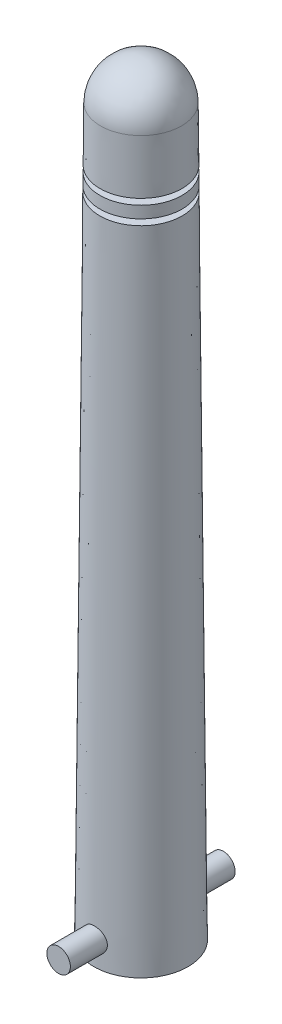
ISO-10303-21;
HEADER;
FILE_DESCRIPTION(('STEP AP214'),'2;1');
FILE_NAME('part.step','',(''),(''),'','','');
FILE_SCHEMA(('AUTOMOTIVE_DESIGN { 1 0 10303 214 1 1 1 1 }'));
ENDSEC;
DATA;
#1=APPLICATION_CONTEXT('core data for automotive mechanical design processes');
#2=APPLICATION_PROTOCOL_DEFINITION('international standard','automotive_design',2000,#1);
#3=PRODUCT_CONTEXT('',#1,'mechanical');
#4=PRODUCT('Part','Part','',(#3));
#5=PRODUCT_RELATED_PRODUCT_CATEGORY('part','',(#4));
#6=PRODUCT_DEFINITION_FORMATION('','',#4);
#7=PRODUCT_DEFINITION_CONTEXT('part definition',#1,'design');
#8=PRODUCT_DEFINITION('design','',#6,#7);
#9=PRODUCT_DEFINITION_SHAPE('','',#8);
#10=(LENGTH_UNIT() NAMED_UNIT(*) SI_UNIT(.MILLI.,.METRE.));
#11=(NAMED_UNIT(*) PLANE_ANGLE_UNIT() SI_UNIT($,.RADIAN.));
#12=(NAMED_UNIT(*) SI_UNIT($,.STERADIAN.) SOLID_ANGLE_UNIT());
#13=UNCERTAINTY_MEASURE_WITH_UNIT(LENGTH_MEASURE(1.E-05),#10,'distance_accuracy_value','');
#14=(GEOMETRIC_REPRESENTATION_CONTEXT(3) GLOBAL_UNCERTAINTY_ASSIGNED_CONTEXT((#13)) GLOBAL_UNIT_ASSIGNED_CONTEXT((#10,
#11,#12)) REPRESENTATION_CONTEXT('',''));
#15=CARTESIAN_POINT('',(0.,0.,0.));
#16=DIRECTION('',(0.,0.,1.));
#17=DIRECTION('',(1.,0.,0.));
#18=AXIS2_PLACEMENT_3D('',#15,#16,#17);
#19=CARTESIAN_POINT('',(0.,0.,0.));
#20=DIRECTION('',(0.,-1.,0.));
#21=DIRECTION('',(0.,0.,-1.));
#22=AXIS2_PLACEMENT_3D('',#19,#20,#21);
#23=CONICAL_SURFACE('',#22,4.,0.00909065866505982);
#24=CARTESIAN_POINT('',(-0.73660515930583,1.32367697120054,3.91934818899298));
#25=CARTESIAN_POINT('',(-0.774372860458464,1.36481272269918,3.91186977942301));
#26=CARTESIAN_POINT('',(-0.808705328189972,1.40913458850612,3.90443939854325));
#27=CARTESIAN_POINT('',(-0.869555005207858,1.5030040900126,3.89046658717942));
#28=CARTESIAN_POINT('',(-0.896068718564904,1.55255404989926,3.88392455459773));
#29=CARTESIAN_POINT('',(-0.940503655070228,1.65561142392132,3.87244123599407));
#30=CARTESIAN_POINT('',(-0.958416282150478,1.70912273572466,3.86750155297934));
#31=CARTESIAN_POINT('',(-0.985006773466895,1.81853540957873,3.85978913531582));
#32=CARTESIAN_POINT('',(-0.993687289706929,1.87443608046321,3.85701577843188));
#33=CARTESIAN_POINT('',(-1.00141962204964,1.98574295953534,3.85396984714066));
#34=CARTESIAN_POINT('',(-1.00067664784285,2.04113350040646,3.85364422050068));
#35=CARTESIAN_POINT('',(-0.990073564216221,2.15099560513558,3.85535064048157));
#36=CARTESIAN_POINT('',(-0.98021368979984,2.20546719264429,3.85738262633136));
#37=CARTESIAN_POINT('',(-0.951871573275743,2.31129864991127,3.86348186915391));
#38=CARTESIAN_POINT('',(-0.933492400891051,2.3626876435991,3.86752483807547));
#39=CARTESIAN_POINT('',(-0.888706923193569,2.46168461670981,3.8771369537));
#40=CARTESIAN_POINT('',(-0.862299556027067,2.50929209491718,3.88270630228082));
#41=CARTESIAN_POINT('',(-0.801497334821846,2.60056440839788,3.89486956118044));
#42=CARTESIAN_POINT('',(-0.766932818245192,2.64411345110363,3.90148408113893));
#43=CARTESIAN_POINT('',(-0.69109207671176,2.72488742760387,3.91488337128324));
#44=CARTESIAN_POINT('',(-0.649814897373874,2.76211146059119,3.92166816556184));
#45=CARTESIAN_POINT('',(-0.560670849799598,2.8299706979853,3.93478877360934));
#46=CARTESIAN_POINT('',(-0.512682857562927,2.8604495327747,3.9411120235586));
#47=CARTESIAN_POINT('',(-0.412114007349366,2.91289497938676,3.95241356570104));
#48=CARTESIAN_POINT('',(-0.359533571868839,2.93486237323773,3.95739198144438));
#49=CARTESIAN_POINT('',(-0.251930893523478,2.96937282721946,3.96537236189164));
#50=CARTESIAN_POINT('',(-0.196946316119994,2.98202771230592,3.96839772287688));
#51=CARTESIAN_POINT('',(-0.0855598352786088,2.9979193260804,3.97221529815477));
#52=CARTESIAN_POINT('',(-0.0291581736937885,3.00115765102228,3.97300789093574));
#53=CARTESIAN_POINT('',(0.0819872861843836,2.99814496307054,3.97227747631158));
#54=CARTESIAN_POINT('',(0.136737867375657,2.99212432332303,3.97081068343005));
#55=CARTESIAN_POINT('',(0.244420206742673,2.9712193864096,3.96582979213715));
#56=CARTESIAN_POINT('',(0.297351943933323,2.95633498701348,3.96231567011291));
#57=CARTESIAN_POINT('',(0.40001483050218,2.9181461649952,3.95362152238037));
#58=CARTESIAN_POINT('',(0.449741510251333,2.89483027125603,3.94843922817037));
#59=CARTESIAN_POINT('',(0.54462790424883,2.84045917659999,3.93697287419231));
#60=CARTESIAN_POINT('',(0.589786903278025,2.80940276628242,3.93068864229985));
#61=CARTESIAN_POINT('',(0.675466054546069,2.73951195541144,3.91753192199128));
#62=CARTESIAN_POINT('',(0.715841394235425,2.70050195901287,3.91064863035481));
#63=CARTESIAN_POINT('',(0.78953730230251,2.61624971843899,3.89722082735216));
#64=CARTESIAN_POINT('',(0.822857226768731,2.57100690604801,3.89067634694868));
#65=CARTESIAN_POINT('',(0.881831050501091,2.47495591465017,3.87863405370068));
#66=CARTESIAN_POINT('',(0.907398630411518,2.4240931039743,3.87314825719366));
#67=CARTESIAN_POINT('',(0.94957912186276,2.31862731993635,3.86401158010774));
#68=CARTESIAN_POINT('',(0.966193707027924,2.2640250477614,3.86036035659233));
#69=CARTESIAN_POINT('',(0.989645099326911,2.15394169878194,3.85544772300329));
#70=CARTESIAN_POINT('',(0.996693532577854,2.09850805124203,3.85413438137991));
#71=CARTESIAN_POINT('',(1.00146741536554,1.98724057167081,3.85394201600469));
#72=CARTESIAN_POINT('',(0.999194105120664,1.9314067938618,3.85506266841095));
#73=CARTESIAN_POINT('',(0.985565711315324,1.82215904591972,3.85959349880932));
#74=CARTESIAN_POINT('',(0.974402718478607,1.76871887958968,3.86295500810796));
#75=CARTESIAN_POINT('',(0.943606522909685,1.6645002543747,3.87156743078853));
#76=CARTESIAN_POINT('',(0.923972520363837,1.61372204733381,3.87681852257282));
#77=CARTESIAN_POINT('',(0.876472062827813,1.51541633143233,3.88875043048223));
#78=CARTESIAN_POINT('',(0.848487473284685,1.46794842534763,3.89545135539288));
#79=CARTESIAN_POINT('',(0.785176804172037,1.37830072244776,3.90953491414134));
#80=CARTESIAN_POINT('',(0.749849387997247,1.33612189064022,3.91691767195617));
#81=CARTESIAN_POINT('',(0.671647892287339,1.25698510646872,3.93182255040201));
#82=CARTESIAN_POINT('',(0.628586280918128,1.2202117930068,3.93934258750624));
#83=CARTESIAN_POINT('',(0.536781990420607,1.15439078108102,3.95350139080542));
#84=CARTESIAN_POINT('',(0.488039291232286,1.12534310989772,3.9601401538884));
#85=CARTESIAN_POINT('',(0.386219615160662,1.07585968993555,3.9718140098235));
#86=CARTESIAN_POINT('',(0.333145750376335,1.055417821501,3.97685024162417));
#87=CARTESIAN_POINT('',(0.224156195140174,1.02379730187781,3.98476646211676));
#88=CARTESIAN_POINT('',(0.168241146783858,1.01261656750701,3.98764693570683));
#89=CARTESIAN_POINT('',(0.0568659576078413,1.00009146112215,3.99088091093674));
#90=CARTESIAN_POINT('',(0.00143823768261932,0.998475939534517,3.99130406459127));
#91=CARTESIAN_POINT('',(-0.10889208848048,1.00441272908199,3.9897645319817));
#92=CARTESIAN_POINT('',(-0.163794689985701,1.01196512276509,3.98780182423529));
#93=CARTESIAN_POINT('',(-0.270763617582212,1.03581573605297,3.9817431458545));
#94=CARTESIAN_POINT('',(-0.32285794155312,1.05199638383612,3.97767587437693));
#95=CARTESIAN_POINT('',(-0.423578517880332,1.09251645299304,3.9678438411747));
#96=CARTESIAN_POINT('',(-0.472205872536826,1.11685326701172,3.96207962200007));
#97=CARTESIAN_POINT('',(-0.558871815407156,1.16940065288724,3.95023980162684));
#98=CARTESIAN_POINT('',(-0.597470485698014,1.19672456908443,3.9442970984907));
#99=CARTESIAN_POINT('',(-0.670397299966514,1.25650095538844,3.93200760970699));
#100=CARTESIAN_POINT('',(-0.70472506853625,1.2889538757611,3.92566078861188));
#101=CARTESIAN_POINT('',(-0.73660515930583,1.32367697120054,3.91934818899298));
#102=B_SPLINE_CURVE_WITH_KNOTS('',3,(#24,#25,#26,#27,#28,#29,#30,#31,#32,#33,#34,#35,#36,#37,
#38,#39,#40,#41,#42,#43,#44,#45,#46,#47,#48,#49,#50,#51,#52,#53,#54,#55,#56,#57,#58,#59,#60,#61,
#62,#63,#64,#65,#66,#67,#68,#69,#70,#71,#72,#73,#74,#75,#76,#77,#78,#79,#80,#81,#82,#83,#84,#85,
#86,#87,#88,#89,#90,#91,#92,#93,#94,#95,#96,#97,#98,#99,#100,#101),.UNSPECIFIED.,.T.,.F.,(4,2,2,
2,2,2,2,2,2,2,2,2,2,2,2,2,2,2,2,2,2,2,2,2,2,2,2,2,2,2,2,2,2,2,2,2,2,2,4),(0.,0.168861724383915,
0.337798836312771,0.506904437172725,0.675961447851619,0.8413434441709,1.00672117760941,
1.17014833352824,1.33359711464324,1.50080328321772,1.66803324535258,1.83880759159144,
2.00956624341873,2.17823937820427,2.34688391859467,2.51139977335502,2.67591752559635,
2.84065995291366,3.00542813621781,3.17433025606928,3.34324778411209,3.5139823655117,
3.68468501963166,3.85154615995758,4.01838510083778,4.18171368021952,4.34505768409351,
4.51083188178182,4.67663628160211,4.84720051259867,5.01776534587848,5.18820868341342,
5.35861367132356,5.52416406583308,5.68971595097106,5.8530675431122,6.01636696491182,
6.15889230066069,6.30143015540358),.UNSPECIFIED.);
#103=CARTESIAN_POINT('',(-0.73660515930583,1.32367697120054,3.91934818899298));
#104=VERTEX_POINT('',#103);
#105=EDGE_CURVE('E50',#104,#104,#102,.T.);
#106=ORIENTED_EDGE('',*,*,#105,.T.);
#107=EDGE_LOOP('',(#106));
#108=FACE_BOUND('',#107,.T.);
#109=CARTESIAN_POINT('',(0.,55.,0.));
#110=DIRECTION('',(0.,-1.,0.));
#111=DIRECTION('',(0.,0.,-1.));
#112=AXIS2_PLACEMENT_3D('',#109,#110,#111);
#113=CIRCLE('',#112,3.5);
#114=CARTESIAN_POINT('',(0.,55.,-3.5));
#115=VERTEX_POINT('',#114);
#116=EDGE_CURVE('E42',#115,#115,#113,.T.);
#117=ORIENTED_EDGE('',*,*,#116,.T.);
#118=EDGE_LOOP('',(#117));
#119=FACE_BOUND('',#118,.T.);
#120=CARTESIAN_POINT('',(0.,0.,0.));
#121=DIRECTION('',(0.,-1.,0.));
#122=DIRECTION('',(0.,0.,-1.));
#123=AXIS2_PLACEMENT_3D('',#120,#121,#122);
#124=CIRCLE('',#123,4.);
#125=CARTESIAN_POINT('',(0.,0.,-4.));
#126=VERTEX_POINT('',#125);
#127=EDGE_CURVE('E10',#126,#126,#124,.T.);
#128=ORIENTED_EDGE('',*,*,#127,.F.);
#129=EDGE_LOOP('',(#128));
#130=FACE_BOUND('',#129,.T.);
#131=CARTESIAN_POINT('',(-0.73660515930583,1.32367697120054,-3.91934818899298));
#132=CARTESIAN_POINT('',(-0.698707221856492,1.28240292887095,-3.92685204872517));
#133=CARTESIAN_POINT('',(-0.65732705974001,1.24431109200918,-3.93440870287531));
#134=CARTESIAN_POINT('',(-0.568679930614547,1.1755285168929,-3.94882756946432));
#135=CARTESIAN_POINT('',(-0.521409961494293,1.14484157660485,-3.95568942449849));
#136=CARTESIAN_POINT('',(-0.422193580885559,1.09174912466115,-3.96799049604438));
#137=CARTESIAN_POINT('',(-0.370243164894148,1.06935078987681,-3.973428478479));
#138=CARTESIAN_POINT('',(-0.263161721927594,1.03359932934912,-3.98227891217748));
#139=CARTESIAN_POINT('',(-0.208031610524256,1.02024361381589,-3.98569194334906));
#140=CARTESIAN_POINT('',(-0.0973640504123917,1.00321019663611,-3.99006837453955));
#141=CARTESIAN_POINT('',(-0.0418583190700446,0.999339030093922,-3.99108072927079));
#142=CARTESIAN_POINT('',(0.069016503205698,1.00084537012953,-3.99068957310302));
#143=CARTESIAN_POINT('',(0.124385603929503,1.00622219355308,-3.98928624065219));
#144=CARTESIAN_POINT('',(0.232425349527251,1.02586347496,-3.98426076808942));
#145=CARTESIAN_POINT('',(0.285126018935846,1.03997357215861,-3.98067718234028));
#146=CARTESIAN_POINT('',(0.387402389143756,1.07649104445144,-3.97169518963713));
#147=CARTESIAN_POINT('',(0.436977802005806,1.09889918276016,-3.96629661575332));
#148=CARTESIAN_POINT('',(0.532551806018069,1.15181146813523,-3.9541235537827));
#149=CARTESIAN_POINT('',(0.5784736079733,1.18244907024599,-3.9473268617749));
#150=CARTESIAN_POINT('',(0.664612419324078,1.25079085585844,-3.93311098351439));
#151=CARTESIAN_POINT('',(0.704828368791595,1.28849634929091,-3.92569168201109));
#152=CARTESIAN_POINT('',(0.779559133403362,1.37113206575594,-3.91078230267643));
#153=CARTESIAN_POINT('',(0.813886955067924,1.41623232317519,-3.90329588077793));
#154=CARTESIAN_POINT('',(0.874497706315896,1.51168687986202,-3.88927664491674));
#155=CARTESIAN_POINT('',(0.90078073050585,1.56204111733364,-3.88274381974026));
#156=CARTESIAN_POINT('',(0.94444767596179,1.66651079529389,-3.8713767631825));
#157=CARTESIAN_POINT('',(0.961853450906484,1.72061662320212,-3.86653836981359));
#158=CARTESIAN_POINT('',(0.987268148049027,1.83113680039714,-3.85909098202773));
#159=CARTESIAN_POINT('',(0.995279233055304,1.88755061525215,-3.85648147452307));
#160=CARTESIAN_POINT('',(1.00151826515165,1.99930115723452,-3.85381606158918));
#161=CARTESIAN_POINT('',(1.0000279215967,2.05462054535775,-3.85368707560767));
#162=CARTESIAN_POINT('',(0.987964178784669,2.16421137381248,-3.85576881285238));
#163=CARTESIAN_POINT('',(0.977391204994835,2.21848286311005,-3.8579794264834));
#164=CARTESIAN_POINT('',(0.947666367816469,2.32387647300214,-3.86440050610538));
#165=CARTESIAN_POINT('',(0.928604988681717,2.37502550462521,-3.86858990657712));
#166=CARTESIAN_POINT('',(0.882503051112953,2.47343643822852,-3.87844821243955));
#167=CARTESIAN_POINT('',(0.85546137337408,2.5206977937392,-3.88411732535963));
#168=CARTESIAN_POINT('',(0.793410581105355,2.61121339873914,-3.89643139885319));
#169=CARTESIAN_POINT('',(0.758226799542237,2.65434517143971,-3.90309641137657));
#170=CARTESIAN_POINT('',(0.681212134640451,2.73418482641939,-3.91653459421434));
#171=CARTESIAN_POINT('',(0.639380341059362,2.77089182757373,-3.92330777922527));
#172=CARTESIAN_POINT('',(0.549242623534467,2.83757845969636,-3.93633586485001));
#173=CARTESIAN_POINT('',(0.500823178260554,2.86740754071842,-3.94257756333158));
#174=CARTESIAN_POINT('',(0.399503175778392,2.91848508103059,-3.95366171455973));
#175=CARTESIAN_POINT('',(0.346603076909814,2.93973441668959,-3.95850431020177));
#176=CARTESIAN_POINT('',(0.238560523990685,2.97274673485345,-3.96617082097517));
#177=CARTESIAN_POINT('',(0.183457849974222,2.98463358778092,-3.96902103738331));
#178=CARTESIAN_POINT('',(0.0719731048289022,2.99898810692203,-3.97247561251449));
#179=CARTESIAN_POINT('',(0.0155912457906433,3.00145732327652,-3.97308034084394));
#180=CARTESIAN_POINT('',(-0.0954062632748371,2.99694987953547,-3.97198789813032));
#181=CARTESIAN_POINT('',(-0.150031790529639,2.99019885295701,-3.97034571079372));
#182=CARTESIAN_POINT('',(-0.257343798738878,2.96787293563652,-3.96504024553938));
#183=CARTESIAN_POINT('',(-0.310030243241659,2.95229787910698,-3.96137692964832));
#184=CARTESIAN_POINT('',(-0.412165531656526,2.91275796139358,-3.95241970330398));
#185=CARTESIAN_POINT('',(-0.461605167766211,2.88877036752247,-3.94712137937397));
#186=CARTESIAN_POINT('',(-0.555812828659444,2.83310669571204,-3.93547295051853));
#187=CARTESIAN_POINT('',(-0.600580104244894,2.80142938745162,-3.92912267733746));
#188=CARTESIAN_POINT('',(-0.685380478965554,2.73033667777246,-3.91588943860429));
#189=CARTESIAN_POINT('',(-0.725264892723395,2.69074555495286,-3.90899705297235));
#190=CARTESIAN_POINT('',(-0.797884431437836,2.60540880944675,-3.89561597598154));
#191=CARTESIAN_POINT('',(-0.830618970463742,2.55966268285507,-3.88912731773917));
#192=CARTESIAN_POINT('',(-0.888291783641758,2.46275899316556,-3.8772680228154));
#193=CARTESIAN_POINT('',(-0.913153581103461,2.41155444278518,-3.87190851300929));
#194=CARTESIAN_POINT('',(-0.953872847530713,2.30553154606881,-3.86307239457098));
#195=CARTESIAN_POINT('',(-0.96973219002034,2.25071395430451,-3.85959539417186));
#196=CARTESIAN_POINT('',(-0.991653997352853,2.14039471973103,-3.85505631922183));
#197=CARTESIAN_POINT('',(-0.997937451309363,2.08493925269514,-3.85393953328125));
#198=CARTESIAN_POINT('',(-1.00120102448954,1.97375789057982,-3.85413745289119));
#199=CARTESIAN_POINT('',(-0.998181423797875,1.91803200369228,-3.85545208523915));
#200=CARTESIAN_POINT('',(-0.983110912953872,1.80905442275429,-3.86034386615726));
#201=CARTESIAN_POINT('',(-0.971239775267828,1.75577559325707,-3.86387576001239));
#202=CARTESIAN_POINT('',(-0.939069726757811,1.65201025008992,-3.87279015181575));
#203=CARTESIAN_POINT('',(-0.918773786296473,1.60152275937013,-3.87817199740508));
#204=CARTESIAN_POINT('',(-0.873723664229115,1.51134238500645,-3.88938787289495));
#205=CARTESIAN_POINT('',(-0.849973998566143,1.47112219501351,-3.89505647726267));
#206=CARTESIAN_POINT('',(-0.797152200209861,1.39442847364758,-3.90692061463553));
#207=CARTESIAN_POINT('',(-0.768079592576452,1.35795527705421,-3.91311619463369));
#208=CARTESIAN_POINT('',(-0.73660515930583,1.32367697120054,-3.91934818899298));
#209=B_SPLINE_CURVE_WITH_KNOTS('',3,(#131,#132,#133,#134,#135,#136,#137,#138,#139,#140,#141,
#142,#143,#144,#145,#146,#147,#148,#149,#150,#151,#152,#153,#154,#155,#156,#157,#158,#159,#160,
#161,#162,#163,#164,#165,#166,#167,#168,#169,#170,#171,#172,#173,#174,#175,#176,#177,#178,#179,
#180,#181,#182,#183,#184,#185,#186,#187,#188,#189,#190,#191,#192,#193,#194,#195,#196,#197,#198,
#199,#200,#201,#202,#203,#204,#205,#206,#207,#208),.UNSPECIFIED.,.T.,.F.,(4,2,2,2,2,2,2,2,2,2,2,
2,2,2,2,2,2,2,2,2,2,2,2,2,2,2,2,2,2,2,2,2,2,2,2,2,2,2,4),(0.,0.169437681435179,
0.338962083499908,0.508632930428893,0.678255163354323,0.844387536955408,1.01050763879113,
1.17377225479477,1.33705189083553,1.5031585089924,1.66929594308627,1.8399979354366,
2.01069792026016,2.18097562898427,2.35121412934622,2.51642915981762,2.6816364513689,
2.84512332969131,3.00863314934819,3.17604330459151,3.34347640132762,3.51428510226081,
3.68507635170599,3.85356810171247,4.02203211681775,4.1864465882386,4.35086414881159,
4.51572947252842,4.68062119139065,4.84969069140674,5.01877404143787,5.18945279190781,
5.36009600894866,5.52673814346687,5.69337526098239,5.85671717493415,6.02000154769695,
6.16070785874299,6.30142673044912),.UNSPECIFIED.);
#210=CARTESIAN_POINT('',(-0.73660515930583,1.32367697120054,-3.91934818899298));
#211=VERTEX_POINT('',#210);
#212=EDGE_CURVE('E35',#211,#211,#209,.T.);
#213=ORIENTED_EDGE('',*,*,#212,.T.);
#214=EDGE_LOOP('',(#213));
#215=FACE_BOUND('',#214,.T.);
#216=ADVANCED_FACE('F31',(#108,#119,#130,#215),#23,.T.);
#217=CARTESIAN_POINT('',(0.,0.,0.));
#218=DIRECTION('',(0.,-1.,0.));
#219=DIRECTION('',(0.,0.,-1.));
#220=AXIS2_PLACEMENT_3D('',#217,#218,#219);
#221=PLANE('',#220);
#222=ORIENTED_EDGE('',*,*,#127,.T.);
#223=EDGE_LOOP('',(#222));
#224=FACE_BOUND('',#223,.T.);
#225=ADVANCED_FACE('F33',(#224),#221,.T.);
#226=CARTESIAN_POINT('',(2.5,55.,0.));
#227=DIRECTION('',(0.,1.,0.));
#228=DIRECTION('',(0.,0.,1.));
#229=AXIS2_PLACEMENT_3D('',#226,#227,#228);
#230=PLANE('',#229);
#231=CARTESIAN_POINT('',(0.,55.,0.));
#232=DIRECTION('',(0.,-1.,0.));
#233=DIRECTION('',(0.,0.,-1.));
#234=AXIS2_PLACEMENT_3D('',#231,#232,#233);
#235=CIRCLE('',#234,2.5);
#236=CARTESIAN_POINT('',(0.,55.,-2.5));
#237=VERTEX_POINT('',#236);
#238=EDGE_CURVE('E47',#237,#237,#235,.T.);
#239=ORIENTED_EDGE('',*,*,#238,.T.);
#240=EDGE_LOOP('',(#239));
#241=FACE_BOUND('',#240,.T.);
#242=ORIENTED_EDGE('',*,*,#116,.F.);
#243=EDGE_LOOP('',(#242));
#244=FACE_BOUND('',#243,.T.);
#245=ADVANCED_FACE('F97',(#241,#244),#230,.T.);
#246=CARTESIAN_POINT('',(0.,0.,0.));
#247=DIRECTION('',(0.,-1.,0.));
#248=DIRECTION('',(0.,0.,-1.));
#249=AXIS2_PLACEMENT_3D('',#246,#247,#248);
#250=CYLINDRICAL_SURFACE('',#249,2.5);
#251=CARTESIAN_POINT('',(0.,55.5,0.));
#252=DIRECTION('',(0.,-1.,0.));
#253=DIRECTION('',(0.,0.,-1.));
#254=AXIS2_PLACEMENT_3D('',#251,#252,#253);
#255=CIRCLE('',#254,2.5);
#256=CARTESIAN_POINT('',(0.,55.5,-2.5));
#257=VERTEX_POINT('',#256);
#258=EDGE_CURVE('E140',#257,#257,#255,.T.);
#259=ORIENTED_EDGE('',*,*,#258,.T.);
#260=EDGE_LOOP('',(#259));
#261=FACE_BOUND('',#260,.T.);
#262=ORIENTED_EDGE('',*,*,#238,.F.);
#263=EDGE_LOOP('',(#262));
#264=FACE_BOUND('',#263,.T.);
#265=ADVANCED_FACE('F94',(#261,#264),#250,.T.);
#266=CARTESIAN_POINT('',(2.5,55.5,0.));
#267=DIRECTION('',(0.,-1.,0.));
#268=DIRECTION('',(0.,0.,-1.));
#269=AXIS2_PLACEMENT_3D('',#266,#267,#268);
#270=PLANE('',#269);
#271=CARTESIAN_POINT('',(0.,55.5,0.));
#272=DIRECTION('',(0.,-1.,0.));
#273=DIRECTION('',(0.,0.,-1.));
#274=AXIS2_PLACEMENT_3D('',#271,#272,#273);
#275=CIRCLE('',#274,3.49545454545455);
#276=CARTESIAN_POINT('',(0.,55.5,-3.49545454545455));
#277=VERTEX_POINT('',#276);
#278=EDGE_CURVE('E137',#277,#277,#275,.T.);
#279=ORIENTED_EDGE('',*,*,#278,.T.);
#280=EDGE_LOOP('',(#279));
#281=FACE_BOUND('',#280,.T.);
#282=ORIENTED_EDGE('',*,*,#258,.F.);
#283=EDGE_LOOP('',(#282));
#284=FACE_BOUND('',#283,.T.);
#285=ADVANCED_FACE('F90',(#281,#284),#270,.T.);
#286=CARTESIAN_POINT('',(0.,55.5,0.));
#287=DIRECTION('',(0.,-1.,0.));
#288=DIRECTION('',(0.,0.,-1.));
#289=AXIS2_PLACEMENT_3D('',#286,#287,#288);
#290=CONICAL_SURFACE('',#289,3.49545454545455,0.00909065866505983);
#291=CARTESIAN_POINT('',(0.,56.5,0.));
#292=DIRECTION('',(0.,-1.,0.));
#293=DIRECTION('',(0.,0.,-1.));
#294=AXIS2_PLACEMENT_3D('',#291,#292,#293);
#295=CIRCLE('',#294,3.48636363636364);
#296=CARTESIAN_POINT('',(0.,56.5,-3.48636363636364));
#297=VERTEX_POINT('',#296);
#298=EDGE_CURVE('E134',#297,#297,#295,.T.);
#299=ORIENTED_EDGE('',*,*,#298,.T.);
#300=EDGE_LOOP('',(#299));
#301=FACE_BOUND('',#300,.T.);
#302=ORIENTED_EDGE('',*,*,#278,.F.);
#303=EDGE_LOOP('',(#302));
#304=FACE_BOUND('',#303,.T.);
#305=ADVANCED_FACE('F86',(#301,#304),#290,.T.);
#306=CARTESIAN_POINT('',(3.48636363636364,56.5,0.));
#307=DIRECTION('',(0.,1.,0.));
#308=DIRECTION('',(0.,0.,1.));
#309=AXIS2_PLACEMENT_3D('',#306,#307,#308);
#310=PLANE('',#309);
#311=CARTESIAN_POINT('',(0.,56.5,0.));
#312=DIRECTION('',(0.,-1.,0.));
#313=DIRECTION('',(0.,0.,-1.));
#314=AXIS2_PLACEMENT_3D('',#311,#312,#313);
#315=CIRCLE('',#314,2.48636363636364);
#316=CARTESIAN_POINT('',(0.,56.5,-2.48636363636364));
#317=VERTEX_POINT('',#316);
#318=EDGE_CURVE('E131',#317,#317,#315,.T.);
#319=ORIENTED_EDGE('',*,*,#318,.T.);
#320=EDGE_LOOP('',(#319));
#321=FACE_BOUND('',#320,.T.);
#322=ORIENTED_EDGE('',*,*,#298,.F.);
#323=EDGE_LOOP('',(#322));
#324=FACE_BOUND('',#323,.T.);
#325=ADVANCED_FACE('F82',(#321,#324),#310,.T.);
#326=CARTESIAN_POINT('',(0.,0.,0.));
#327=DIRECTION('',(0.,-1.,0.));
#328=DIRECTION('',(0.,0.,-1.));
#329=AXIS2_PLACEMENT_3D('',#326,#327,#328);
#330=CYLINDRICAL_SURFACE('',#329,2.48636363636364);
#331=CARTESIAN_POINT('',(0.,57.,0.));
#332=DIRECTION('',(0.,-1.,0.));
#333=DIRECTION('',(0.,0.,-1.));
#334=AXIS2_PLACEMENT_3D('',#331,#332,#333);
#335=CIRCLE('',#334,2.48636363636364);
#336=CARTESIAN_POINT('',(0.,57.,-2.48636363636364));
#337=VERTEX_POINT('',#336);
#338=EDGE_CURVE('E124',#337,#337,#335,.T.);
#339=ORIENTED_EDGE('',*,*,#338,.T.);
#340=EDGE_LOOP('',(#339));
#341=FACE_BOUND('',#340,.T.);
#342=ORIENTED_EDGE('',*,*,#318,.F.);
#343=EDGE_LOOP('',(#342));
#344=FACE_BOUND('',#343,.T.);
#345=ADVANCED_FACE('F78',(#341,#344),#330,.T.);
#346=CARTESIAN_POINT('',(2.48636363636364,57.,0.));
#347=DIRECTION('',(0.,-1.,0.));
#348=DIRECTION('',(0.,0.,-1.));
#349=AXIS2_PLACEMENT_3D('',#346,#347,#348);
#350=PLANE('',#349);
#351=CARTESIAN_POINT('',(0.,57.,0.));
#352=DIRECTION('',(0.,-1.,0.));
#353=DIRECTION('',(0.,0.,-1.));
#354=AXIS2_PLACEMENT_3D('',#351,#352,#353);
#355=CIRCLE('',#354,3.48181818181818);
#356=CARTESIAN_POINT('',(0.,57.,-3.48181818181818));
#357=VERTEX_POINT('',#356);
#358=EDGE_CURVE('E120',#357,#357,#355,.T.);
#359=ORIENTED_EDGE('',*,*,#358,.T.);
#360=EDGE_LOOP('',(#359));
#361=FACE_BOUND('',#360,.T.);
#362=ORIENTED_EDGE('',*,*,#338,.F.);
#363=EDGE_LOOP('',(#362));
#364=FACE_BOUND('',#363,.T.);
#365=ADVANCED_FACE('F74',(#361,#364),#350,.T.);
#366=CARTESIAN_POINT('',(0.,57.,0.));
#367=DIRECTION('',(0.,-1.,0.));
#368=DIRECTION('',(0.,0.,-1.));
#369=AXIS2_PLACEMENT_3D('',#366,#367,#368);
#370=CONICAL_SURFACE('',#369,3.48181818181818,0.00909065866505981);
#371=CARTESIAN_POINT('',(0.,61.5910499537061,0.));
#372=DIRECTION('',(0.,-1.,0.));
#373=DIRECTION('',(0.,0.,-1.));
#374=AXIS2_PLACEMENT_3D('',#371,#372,#373);
#375=CIRCLE('',#374,3.44008136405722);
#376=CARTESIAN_POINT('',(0.,61.5910499537061,-3.44008136405722));
#377=VERTEX_POINT('',#376);
#378=EDGE_CURVE('E118',#377,#377,#375,.T.);
#379=ORIENTED_EDGE('',*,*,#378,.T.);
#380=EDGE_LOOP('',(#379));
#381=FACE_BOUND('',#380,.T.);
#382=ORIENTED_EDGE('',*,*,#358,.F.);
#383=EDGE_LOOP('',(#382));
#384=FACE_BOUND('',#383,.T.);
#385=ADVANCED_FACE('F70',(#381,#384),#370,.T.);
#386=CARTESIAN_POINT('',(0.,61.5597764867601,0.));
#387=DIRECTION('',(0.,-1.,0.));
#388=DIRECTION('',(1.,0.,0.));
#389=AXIS2_PLACEMENT_3D('',#386,#387,#388);
#390=SPHERICAL_SURFACE('',#389,3.44022351324133);
#391=ORIENTED_EDGE('',*,*,#378,.F.);
#392=EDGE_LOOP('',(#391));
#393=FACE_BOUND('',#392,.T.);
#394=ADVANCED_FACE('F66',(#393),#390,.T.);
#395=CARTESIAN_POINT('',(0.,2.,7.));
#396=DIRECTION('',(0.,0.,1.));
#397=DIRECTION('',(1.,0.,0.));
#398=AXIS2_PLACEMENT_3D('',#395,#396,#397);
#399=PLANE('',#398);
#400=CARTESIAN_POINT('',(0.,2.,7.));
#401=DIRECTION('',(0.,0.,1.));
#402=DIRECTION('',(1.,0.,0.));
#403=AXIS2_PLACEMENT_3D('',#400,#401,#402);
#404=CIRCLE('',#403,1.);
#405=CARTESIAN_POINT('',(1.,2.,7.));
#406=VERTEX_POINT('',#405);
#407=EDGE_CURVE('E54',#406,#406,#404,.T.);
#408=ORIENTED_EDGE('',*,*,#407,.T.);
#409=EDGE_LOOP('',(#408));
#410=FACE_BOUND('',#409,.T.);
#411=ADVANCED_FACE('F63',(#410),#399,.T.);
#412=CARTESIAN_POINT('',(0.,2.,7.));
#413=DIRECTION('',(0.,0.,-1.));
#414=DIRECTION('',(-1.,0.,0.));
#415=AXIS2_PLACEMENT_3D('',#412,#413,#414);
#416=CYLINDRICAL_SURFACE('',#415,1.);
#417=ORIENTED_EDGE('',*,*,#105,.F.);
#418=EDGE_LOOP('',(#417));
#419=FACE_BOUND('',#418,.T.);
#420=ORIENTED_EDGE('',*,*,#407,.F.);
#421=EDGE_LOOP('',(#420));
#422=FACE_BOUND('',#421,.T.);
#423=ADVANCED_FACE('F57',(#419,#422),#416,.T.);
#424=ORIENTED_EDGE('',*,*,#212,.F.);
#425=EDGE_LOOP('',(#424));
#426=FACE_BOUND('',#425,.T.);
#427=CARTESIAN_POINT('',(0.,2.,-7.));
#428=DIRECTION('',(0.,0.,1.));
#429=DIRECTION('',(1.,0.,0.));
#430=AXIS2_PLACEMENT_3D('',#427,#428,#429);
#431=CIRCLE('',#430,1.);
#432=CARTESIAN_POINT('',(1.,2.,-7.));
#433=VERTEX_POINT('',#432);
#434=EDGE_CURVE('E155',#433,#433,#431,.T.);
#435=ORIENTED_EDGE('',*,*,#434,.T.);
#436=EDGE_LOOP('',(#435));
#437=FACE_BOUND('',#436,.T.);
#438=ADVANCED_FACE('F62',(#426,#437),#416,.T.);
#439=CARTESIAN_POINT('',(0.,2.,-7.));
#440=DIRECTION('',(0.,0.,1.));
#441=DIRECTION('',(1.,0.,0.));
#442=AXIS2_PLACEMENT_3D('',#439,#440,#441);
#443=PLANE('',#442);
#444=ORIENTED_EDGE('',*,*,#434,.F.);
#445=EDGE_LOOP('',(#444));
#446=FACE_BOUND('',#445,.T.);
#447=ADVANCED_FACE('F160',(#446),#443,.F.);
#448=CLOSED_SHELL('',(#216,#225,#245,#265,#285,#305,#325,#345,#365,#385,#394,#411,#423,#438,#447));
#449=MANIFOLD_SOLID_BREP('B2',#448);
#450=ADVANCED_BREP_SHAPE_REPRESENTATION('',(#18,#449),#14);
#451=SHAPE_DEFINITION_REPRESENTATION(#9,#450);
ENDSEC;
END-ISO-10303-21;
